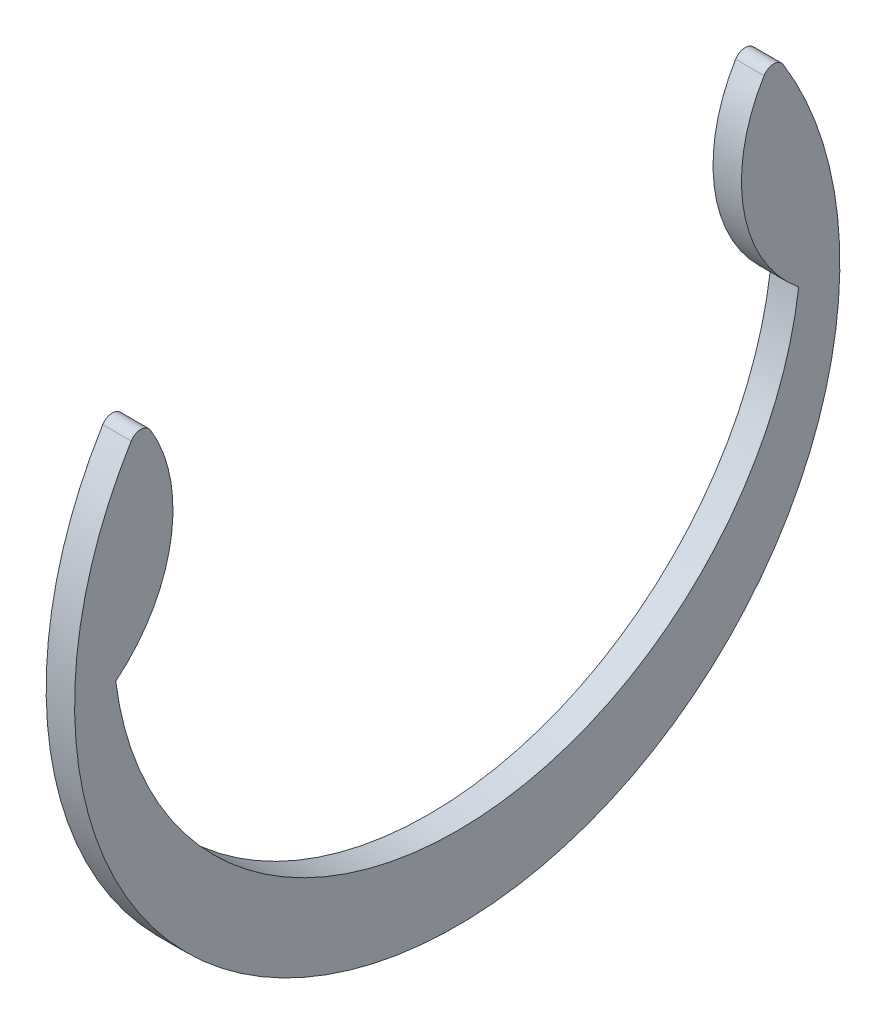
ISO-10303-21;
HEADER;
FILE_DESCRIPTION(('STEP AP214'),'2;1');
FILE_NAME('part.step','',(''),(''),'','','');
FILE_SCHEMA(('AUTOMOTIVE_DESIGN { 1 0 10303 214 1 1 1 1 }'));
ENDSEC;
DATA;
#1=APPLICATION_CONTEXT('core data for automotive mechanical design processes');
#2=APPLICATION_PROTOCOL_DEFINITION('international standard','automotive_design',2000,#1);
#3=PRODUCT_CONTEXT('',#1,'mechanical');
#4=PRODUCT('Part','Part','',(#3));
#5=PRODUCT_RELATED_PRODUCT_CATEGORY('part','',(#4));
#6=PRODUCT_DEFINITION_FORMATION('','',#4);
#7=PRODUCT_DEFINITION_CONTEXT('part definition',#1,'design');
#8=PRODUCT_DEFINITION('design','',#6,#7);
#9=PRODUCT_DEFINITION_SHAPE('','',#8);
#10=(LENGTH_UNIT() NAMED_UNIT(*) SI_UNIT(.MILLI.,.METRE.));
#11=(NAMED_UNIT(*) PLANE_ANGLE_UNIT() SI_UNIT($,.RADIAN.));
#12=(NAMED_UNIT(*) SI_UNIT($,.STERADIAN.) SOLID_ANGLE_UNIT());
#13=UNCERTAINTY_MEASURE_WITH_UNIT(LENGTH_MEASURE(1.E-05),#10,'distance_accuracy_value','');
#14=(GEOMETRIC_REPRESENTATION_CONTEXT(3) GLOBAL_UNCERTAINTY_ASSIGNED_CONTEXT((#13)) GLOBAL_UNIT_ASSIGNED_CONTEXT((#10,
#11,#12)) REPRESENTATION_CONTEXT('',''));
#15=CARTESIAN_POINT('',(0.,0.,0.));
#16=DIRECTION('',(0.,0.,1.));
#17=DIRECTION('',(1.,0.,0.));
#18=AXIS2_PLACEMENT_3D('',#15,#16,#17);
#19=CARTESIAN_POINT('',(0.5334,4.49687682819722,16.4442523780164));
#20=DIRECTION('',(-1.,0.,0.));
#21=DIRECTION('',(0.,0.,1.));
#22=AXIS2_PLACEMENT_3D('',#19,#20,#21);
#23=CYLINDRICAL_SURFACE('',#22,5.78313031085629);
#24=CARTESIAN_POINT('',(-0.5334,4.49687682819722,16.4442523780164));
#25=DIRECTION('',(1.,0.,0.));
#26=DIRECTION('',(0.,0.,1.));
#27=AXIS2_PLACEMENT_3D('',#24,#25,#26);
#28=CIRCLE('',#27,5.78313031085629);
#29=CARTESIAN_POINT('',(-0.5334,0.,12.80795));
#30=VERTEX_POINT('',#29);
#31=CARTESIAN_POINT('',(-0.5334,7.50888522101841,11.5074111172587));
#32=VERTEX_POINT('',#31);
#33=EDGE_CURVE('E121',#30,#32,#28,.T.);
#34=ORIENTED_EDGE('',*,*,#33,.T.);
#35=DIRECTION('',(-1.,0.,0.));
#36=VECTOR('',#35,1.);
#37=CARTESIAN_POINT('',(0.5334,7.50888522101841,11.5074111172587));
#38=LINE('',#37,#36);
#39=CARTESIAN_POINT('',(0.5334,7.50888522101841,11.5074111172587));
#40=VERTEX_POINT('',#39);
#41=EDGE_CURVE('E11',#40,#32,#38,.T.);
#42=ORIENTED_EDGE('',*,*,#41,.F.);
#43=CARTESIAN_POINT('',(0.5334,4.49687682819722,16.4442523780164));
#44=DIRECTION('',(1.,0.,0.));
#45=DIRECTION('',(0.,0.,1.));
#46=AXIS2_PLACEMENT_3D('',#43,#44,#45);
#47=CIRCLE('',#46,5.78313031085629);
#48=CARTESIAN_POINT('',(0.5334,0.,12.80795));
#49=VERTEX_POINT('',#48);
#50=EDGE_CURVE('E131',#49,#40,#47,.T.);
#51=ORIENTED_EDGE('',*,*,#50,.F.);
#52=DIRECTION('',(-1.,0.,0.));
#53=VECTOR('',#52,1.);
#54=CARTESIAN_POINT('',(0.5334,0.,12.80795));
#55=LINE('',#54,#53);
#56=EDGE_CURVE('E117',#49,#30,#55,.T.);
#57=ORIENTED_EDGE('',*,*,#56,.T.);
#58=EDGE_LOOP('',(#34,#42,#51,#57));
#59=FACE_BOUND('',#58,.T.);
#60=ADVANCED_FACE('F37',(#59),#23,.T.);
#61=CARTESIAN_POINT('',(0.5334,7.28852012229223,11.8686011837988));
#62=DIRECTION('',(-1.,0.,0.));
#63=DIRECTION('',(0.,0.,1.));
#64=AXIS2_PLACEMENT_3D('',#61,#62,#63);
#65=CYLINDRICAL_SURFACE('',#64,0.423106417942133);
#66=CARTESIAN_POINT('',(-0.5334,7.28852012229223,11.8686011837988));
#67=DIRECTION('',(1.,0.,0.));
#68=DIRECTION('',(0.,0.,1.));
#69=AXIS2_PLACEMENT_3D('',#66,#67,#68);
#70=CIRCLE('',#69,0.423106417942133);
#71=CARTESIAN_POINT('',(-0.5334,7.50993333333333,12.2291496977054));
#72=VERTEX_POINT('',#71);
#73=EDGE_CURVE('E124',#32,#72,#70,.T.);
#74=ORIENTED_EDGE('',*,*,#73,.T.);
#75=DIRECTION('',(-1.,0.,0.));
#76=VECTOR('',#75,1.);
#77=CARTESIAN_POINT('',(0.5334,7.50993333333333,12.2291496977054));
#78=LINE('',#77,#76);
#79=CARTESIAN_POINT('',(0.5334,7.50993333333333,12.2291496977054));
#80=VERTEX_POINT('',#79);
#81=EDGE_CURVE('E45',#80,#72,#78,.T.);
#82=ORIENTED_EDGE('',*,*,#81,.F.);
#83=CARTESIAN_POINT('',(0.5334,7.28852012229223,11.8686011837988));
#84=DIRECTION('',(1.,0.,0.));
#85=DIRECTION('',(0.,0.,1.));
#86=AXIS2_PLACEMENT_3D('',#83,#84,#85);
#87=CIRCLE('',#86,0.423106417942133);
#88=EDGE_CURVE('E90',#40,#80,#87,.T.);
#89=ORIENTED_EDGE('',*,*,#88,.F.);
#90=ORIENTED_EDGE('',*,*,#41,.T.);
#91=EDGE_LOOP('',(#74,#82,#89,#90));
#92=FACE_BOUND('',#91,.T.);
#93=ADVANCED_FACE('F155',(#92),#65,.T.);
#94=CARTESIAN_POINT('',(0.5334,0.,0.));
#95=DIRECTION('',(-1.,0.,0.));
#96=DIRECTION('',(0.,0.,1.));
#97=AXIS2_PLACEMENT_3D('',#94,#95,#96);
#98=CYLINDRICAL_SURFACE('',#97,14.351);
#99=CARTESIAN_POINT('',(-0.5334,0.,0.));
#100=DIRECTION('',(1.,0.,0.));
#101=DIRECTION('',(0.,0.,1.));
#102=AXIS2_PLACEMENT_3D('',#99,#100,#101);
#103=CIRCLE('',#102,14.351);
#104=CARTESIAN_POINT('',(-0.5334,7.50993333333333,-12.2291496977054));
#105=VERTEX_POINT('',#104);
#106=EDGE_CURVE('E126',#72,#105,#103,.T.);
#107=ORIENTED_EDGE('',*,*,#106,.T.);
#108=DIRECTION('',(-1.,0.,0.));
#109=VECTOR('',#108,1.);
#110=CARTESIAN_POINT('',(0.5334,7.50993333333333,-12.2291496977054));
#111=LINE('',#110,#109);
#112=CARTESIAN_POINT('',(0.5334,7.50993333333333,-12.2291496977054));
#113=VERTEX_POINT('',#112);
#114=EDGE_CURVE('E112',#113,#105,#111,.T.);
#115=ORIENTED_EDGE('',*,*,#114,.F.);
#116=CARTESIAN_POINT('',(0.5334,0.,0.));
#117=DIRECTION('',(1.,0.,0.));
#118=DIRECTION('',(0.,0.,1.));
#119=AXIS2_PLACEMENT_3D('',#116,#117,#118);
#120=CIRCLE('',#119,14.351);
#121=EDGE_CURVE('E103',#80,#113,#120,.T.);
#122=ORIENTED_EDGE('',*,*,#121,.F.);
#123=ORIENTED_EDGE('',*,*,#81,.T.);
#124=EDGE_LOOP('',(#107,#115,#122,#123));
#125=FACE_BOUND('',#124,.T.);
#126=ADVANCED_FACE('F137',(#125),#98,.T.);
#127=CARTESIAN_POINT('',(0.5334,7.28852012229223,-11.8686011837988));
#128=DIRECTION('',(-1.,0.,0.));
#129=DIRECTION('',(0.,0.,1.));
#130=AXIS2_PLACEMENT_3D('',#127,#128,#129);
#131=CYLINDRICAL_SURFACE('',#130,0.423106417942133);
#132=CARTESIAN_POINT('',(-0.5334,7.28852012229223,-11.8686011837988));
#133=DIRECTION('',(1.,0.,0.));
#134=DIRECTION('',(0.,0.,-1.));
#135=AXIS2_PLACEMENT_3D('',#132,#133,#134);
#136=CIRCLE('',#135,0.423106417942133);
#137=CARTESIAN_POINT('',(-0.5334,7.50888522101841,-11.5074111172587));
#138=VERTEX_POINT('',#137);
#139=EDGE_CURVE('E111',#105,#138,#136,.T.);
#140=ORIENTED_EDGE('',*,*,#139,.T.);
#141=DIRECTION('',(-1.,0.,0.));
#142=VECTOR('',#141,1.);
#143=CARTESIAN_POINT('',(0.5334,7.50888522101841,-11.5074111172587));
#144=LINE('',#143,#142);
#145=CARTESIAN_POINT('',(0.5334,7.50888522101841,-11.5074111172587));
#146=VERTEX_POINT('',#145);
#147=EDGE_CURVE('E108',#146,#138,#144,.T.);
#148=ORIENTED_EDGE('',*,*,#147,.F.);
#149=CARTESIAN_POINT('',(0.5334,7.28852012229223,-11.8686011837988));
#150=DIRECTION('',(1.,0.,0.));
#151=DIRECTION('',(0.,0.,-1.));
#152=AXIS2_PLACEMENT_3D('',#149,#150,#151);
#153=CIRCLE('',#152,0.423106417942133);
#154=EDGE_CURVE('E97',#113,#146,#153,.T.);
#155=ORIENTED_EDGE('',*,*,#154,.F.);
#156=ORIENTED_EDGE('',*,*,#114,.T.);
#157=EDGE_LOOP('',(#140,#148,#155,#156));
#158=FACE_BOUND('',#157,.T.);
#159=ADVANCED_FACE('F109',(#158),#131,.T.);
#160=CARTESIAN_POINT('',(0.5334,4.49687682819722,-16.4442523780164));
#161=DIRECTION('',(-1.,0.,0.));
#162=DIRECTION('',(0.,0.,1.));
#163=AXIS2_PLACEMENT_3D('',#160,#161,#162);
#164=CYLINDRICAL_SURFACE('',#163,5.78313031085629);
#165=CARTESIAN_POINT('',(-0.5334,4.49687682819722,-16.4442523780164));
#166=DIRECTION('',(1.,0.,0.));
#167=DIRECTION('',(0.,0.,1.));
#168=AXIS2_PLACEMENT_3D('',#165,#166,#167);
#169=CIRCLE('',#168,5.78313031085629);
#170=CARTESIAN_POINT('',(-0.5334,0.,-12.80795));
#171=VERTEX_POINT('',#170);
#172=EDGE_CURVE('E76',#138,#171,#169,.T.);
#173=ORIENTED_EDGE('',*,*,#172,.T.);
#174=DIRECTION('',(-1.,0.,0.));
#175=VECTOR('',#174,1.);
#176=CARTESIAN_POINT('',(0.5334,0.,-12.80795));
#177=LINE('',#176,#175);
#178=CARTESIAN_POINT('',(0.5334,0.,-12.80795));
#179=VERTEX_POINT('',#178);
#180=EDGE_CURVE('E113',#179,#171,#177,.T.);
#181=ORIENTED_EDGE('',*,*,#180,.F.);
#182=CARTESIAN_POINT('',(0.5334,4.49687682819722,-16.4442523780164));
#183=DIRECTION('',(1.,0.,0.));
#184=DIRECTION('',(0.,0.,1.));
#185=AXIS2_PLACEMENT_3D('',#182,#183,#184);
#186=CIRCLE('',#185,5.78313031085629);
#187=EDGE_CURVE('E101',#146,#179,#186,.T.);
#188=ORIENTED_EDGE('',*,*,#187,.F.);
#189=ORIENTED_EDGE('',*,*,#147,.T.);
#190=EDGE_LOOP('',(#173,#181,#188,#189));
#191=FACE_BOUND('',#190,.T.);
#192=ADVANCED_FACE('F115',(#191),#164,.T.);
#193=CARTESIAN_POINT('',(0.5334,1.64873239853438,0.));
#194=DIRECTION('',(-1.,0.,0.));
#195=DIRECTION('',(0.,0.,1.));
#196=AXIS2_PLACEMENT_3D('',#193,#194,#195);
#197=CYLINDRICAL_SURFACE('',#196,12.9136323985344);
#198=CARTESIAN_POINT('',(-0.5334,1.64873239853438,0.));
#199=DIRECTION('',(-1.,0.,0.));
#200=DIRECTION('',(0.,0.,-1.));
#201=AXIS2_PLACEMENT_3D('',#198,#199,#200);
#202=CIRCLE('',#201,12.9136323985344);
#203=EDGE_CURVE('E82',#171,#30,#202,.T.);
#204=ORIENTED_EDGE('',*,*,#203,.T.);
#205=ORIENTED_EDGE('',*,*,#56,.F.);
#206=CARTESIAN_POINT('',(0.5334,1.64873239853438,0.));
#207=DIRECTION('',(-1.,0.,0.));
#208=DIRECTION('',(0.,0.,-1.));
#209=AXIS2_PLACEMENT_3D('',#206,#207,#208);
#210=CIRCLE('',#209,12.9136323985344);
#211=EDGE_CURVE('E53',#179,#49,#210,.T.);
#212=ORIENTED_EDGE('',*,*,#211,.F.);
#213=ORIENTED_EDGE('',*,*,#180,.T.);
#214=EDGE_LOOP('',(#204,#205,#212,#213));
#215=FACE_BOUND('',#214,.T.);
#216=ADVANCED_FACE('F144',(#215),#197,.F.);
#217=CARTESIAN_POINT('',(0.5334,3.0728046133658,8.22212618900819));
#218=DIRECTION('',(-1.,0.,0.));
#219=DIRECTION('',(0.,0.,1.));
#220=AXIS2_PLACEMENT_3D('',#217,#218,#219);
#221=PLANE('',#220);
#222=ORIENTED_EDGE('',*,*,#50,.T.);
#223=ORIENTED_EDGE('',*,*,#88,.T.);
#224=ORIENTED_EDGE('',*,*,#121,.T.);
#225=ORIENTED_EDGE('',*,*,#154,.T.);
#226=ORIENTED_EDGE('',*,*,#187,.T.);
#227=ORIENTED_EDGE('',*,*,#211,.T.);
#228=EDGE_LOOP('',(#222,#223,#224,#225,#226,#227));
#229=FACE_BOUND('',#228,.T.);
#230=ADVANCED_FACE('F99',(#229),#221,.F.);
#231=CARTESIAN_POINT('',(-0.5334,3.0728046133658,8.22212618900819));
#232=DIRECTION('',(-1.,0.,0.));
#233=DIRECTION('',(0.,0.,1.));
#234=AXIS2_PLACEMENT_3D('',#231,#232,#233);
#235=PLANE('',#234);
#236=ORIENTED_EDGE('',*,*,#33,.F.);
#237=ORIENTED_EDGE('',*,*,#203,.F.);
#238=ORIENTED_EDGE('',*,*,#172,.F.);
#239=ORIENTED_EDGE('',*,*,#139,.F.);
#240=ORIENTED_EDGE('',*,*,#106,.F.);
#241=ORIENTED_EDGE('',*,*,#73,.F.);
#242=EDGE_LOOP('',(#236,#237,#238,#239,#240,#241));
#243=FACE_BOUND('',#242,.T.);
#244=ADVANCED_FACE('F140',(#243),#235,.T.);
#245=CLOSED_SHELL('',(#60,#93,#126,#159,#192,#216,#230,#244));
#246=MANIFOLD_SOLID_BREP('B2',#245);
#247=ADVANCED_BREP_SHAPE_REPRESENTATION('',(#18,#246),#14);
#248=SHAPE_DEFINITION_REPRESENTATION(#9,#247);
ENDSEC;
END-ISO-10303-21;
